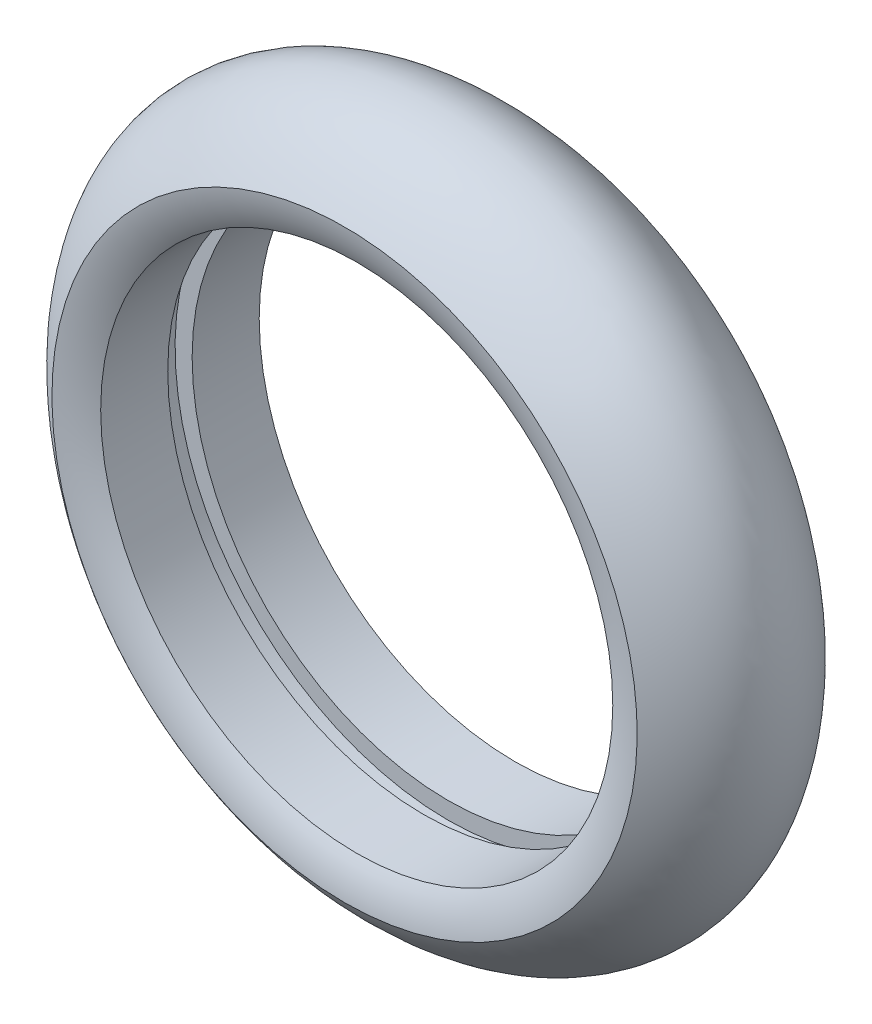
ISO-10303-21;
HEADER;
FILE_DESCRIPTION(('STEP AP214'),'2;1');
FILE_NAME('part.step','',(''),(''),'','','');
FILE_SCHEMA(('AUTOMOTIVE_DESIGN { 1 0 10303 214 1 1 1 1 }'));
ENDSEC;
DATA;
#1=APPLICATION_CONTEXT('core data for automotive mechanical design processes');
#2=APPLICATION_PROTOCOL_DEFINITION('international standard','automotive_design',2000,#1);
#3=PRODUCT_CONTEXT('',#1,'mechanical');
#4=PRODUCT('Part','Part','',(#3));
#5=PRODUCT_RELATED_PRODUCT_CATEGORY('part','',(#4));
#6=PRODUCT_DEFINITION_FORMATION('','',#4);
#7=PRODUCT_DEFINITION_CONTEXT('part definition',#1,'design');
#8=PRODUCT_DEFINITION('design','',#6,#7);
#9=PRODUCT_DEFINITION_SHAPE('','',#8);
#10=(LENGTH_UNIT() NAMED_UNIT(*) SI_UNIT(.MILLI.,.METRE.));
#11=(NAMED_UNIT(*) PLANE_ANGLE_UNIT() SI_UNIT($,.RADIAN.));
#12=(NAMED_UNIT(*) SI_UNIT($,.STERADIAN.) SOLID_ANGLE_UNIT());
#13=UNCERTAINTY_MEASURE_WITH_UNIT(LENGTH_MEASURE(1.E-05),#10,'distance_accuracy_value','');
#14=(GEOMETRIC_REPRESENTATION_CONTEXT(3) GLOBAL_UNCERTAINTY_ASSIGNED_CONTEXT((#13)) GLOBAL_UNIT_ASSIGNED_CONTEXT((#10,
#11,#12)) REPRESENTATION_CONTEXT('',''));
#15=CARTESIAN_POINT('',(0.,0.,0.));
#16=DIRECTION('',(0.,0.,1.));
#17=DIRECTION('',(1.,0.,0.));
#18=AXIS2_PLACEMENT_3D('',#15,#16,#17);
#19=CARTESIAN_POINT('',(0.,0.,0.));
#20=DIRECTION('',(0.,0.,1.));
#21=DIRECTION('',(0.,-1.,0.));
#22=AXIS2_PLACEMENT_3D('',#19,#20,#21);
#23=TOROIDAL_SURFACE('',#22,24.8333333333333,7.54615428178118);
#24=CARTESIAN_POINT('',(0.,0.,6.5));
#25=DIRECTION('',(0.,0.,1.));
#26=DIRECTION('',(0.,-1.,0.));
#27=AXIS2_PLACEMENT_3D('',#24,#25,#26);
#28=CIRCLE('',#27,21.);
#29=CARTESIAN_POINT('',(0.,-21.,6.5));
#30=VERTEX_POINT('',#29);
#31=EDGE_CURVE('E62',#30,#30,#28,.T.);
#32=ORIENTED_EDGE('',*,*,#31,.F.);
#33=EDGE_LOOP('',(#32));
#34=FACE_BOUND('',#33,.T.);
#35=CARTESIAN_POINT('',(0.,0.,7.5));
#36=DIRECTION('',(0.,0.,1.));
#37=DIRECTION('',(0.,-1.,0.));
#38=AXIS2_PLACEMENT_3D('',#35,#36,#37);
#39=CIRCLE('',#38,24.);
#40=CARTESIAN_POINT('',(0.,-24.,7.5));
#41=VERTEX_POINT('',#40);
#42=EDGE_CURVE('E10',#41,#41,#39,.T.);
#43=ORIENTED_EDGE('',*,*,#42,.T.);
#44=EDGE_LOOP('',(#43));
#45=FACE_BOUND('',#44,.T.);
#46=ADVANCED_FACE('F34',(#34,#45),#23,.T.);
#47=CARTESIAN_POINT('',(0.,0.,0.));
#48=DIRECTION('',(1.,0.,0.));
#49=DIRECTION('',(0.,1.,0.));
#50=AXIS2_PLACEMENT_3D('',#47,#48,#49);
#51=ELLIPSE('',#50,29.,13.3609187911384);
#52=TRIMMED_CURVE('',#51,(PARAMETER_VALUE(4.71238898038469)),
(PARAMETER_VALUE(7.85398163397448)),.T.,.PARAMETER.);
#53=CARTESIAN_POINT('',(0.,0.,13.3609187911384));
#54=DIRECTION('',(0.,0.,1.));
#55=AXIS1_PLACEMENT('',#53,#54);
#56=SURFACE_OF_REVOLUTION('',#52,#55);
#57=ORIENTED_EDGE('',*,*,#42,.F.);
#58=EDGE_LOOP('',(#57));
#59=FACE_BOUND('',#58,.T.);
#60=CARTESIAN_POINT('',(0.,0.,-7.5));
#61=DIRECTION('',(0.,0.,1.));
#62=DIRECTION('',(0.,-1.,0.));
#63=AXIS2_PLACEMENT_3D('',#60,#61,#62);
#64=CIRCLE('',#63,24.);
#65=CARTESIAN_POINT('',(0.,-24.,-7.5));
#66=VERTEX_POINT('',#65);
#67=EDGE_CURVE('E40',#66,#66,#64,.T.);
#68=ORIENTED_EDGE('',*,*,#67,.T.);
#69=EDGE_LOOP('',(#68));
#70=FACE_BOUND('',#69,.T.);
#71=ADVANCED_FACE('F66',(#59,#70),#56,.T.);
#72=CARTESIAN_POINT('',(0.,0.,0.));
#73=DIRECTION('',(0.,0.,1.));
#74=DIRECTION('',(0.,-1.,0.));
#75=AXIS2_PLACEMENT_3D('',#72,#73,#74);
#76=TOROIDAL_SURFACE('',#75,24.8333333333333,7.54615428178118);
#77=ORIENTED_EDGE('',*,*,#67,.F.);
#78=EDGE_LOOP('',(#77));
#79=FACE_BOUND('',#78,.T.);
#80=CARTESIAN_POINT('',(0.,0.,-6.5));
#81=DIRECTION('',(0.,0.,1.));
#82=DIRECTION('',(0.,-1.,0.));
#83=AXIS2_PLACEMENT_3D('',#80,#81,#82);
#84=CIRCLE('',#83,21.);
#85=CARTESIAN_POINT('',(0.,-21.,-6.5));
#86=VERTEX_POINT('',#85);
#87=EDGE_CURVE('E44',#86,#86,#84,.T.);
#88=ORIENTED_EDGE('',*,*,#87,.T.);
#89=EDGE_LOOP('',(#88));
#90=FACE_BOUND('',#89,.T.);
#91=ADVANCED_FACE('F69',(#79,#90),#76,.T.);
#92=CARTESIAN_POINT('',(0.,0.,13.3609187911384));
#93=DIRECTION('',(0.,0.,1.));
#94=DIRECTION('',(0.,-1.,0.));
#95=AXIS2_PLACEMENT_3D('',#92,#93,#94);
#96=CYLINDRICAL_SURFACE('',#95,21.);
#97=ORIENTED_EDGE('',*,*,#87,.F.);
#98=EDGE_LOOP('',(#97));
#99=FACE_BOUND('',#98,.T.);
#100=CARTESIAN_POINT('',(0.,0.,-1.));
#101=DIRECTION('',(0.,0.,1.));
#102=DIRECTION('',(0.,-1.,0.));
#103=AXIS2_PLACEMENT_3D('',#100,#101,#102);
#104=CIRCLE('',#103,21.);
#105=CARTESIAN_POINT('',(0.,-21.,-1.));
#106=VERTEX_POINT('',#105);
#107=EDGE_CURVE('E48',#106,#106,#104,.T.);
#108=ORIENTED_EDGE('',*,*,#107,.T.);
#109=EDGE_LOOP('',(#108));
#110=FACE_BOUND('',#109,.T.);
#111=ADVANCED_FACE('F73',(#99,#110),#96,.F.);
#112=CARTESIAN_POINT('',(0.,22.4,-1.));
#113=DIRECTION('',(0.,0.,-1.));
#114=DIRECTION('',(0.,1.,0.));
#115=AXIS2_PLACEMENT_3D('',#112,#113,#114);
#116=PLANE('',#115);
#117=ORIENTED_EDGE('',*,*,#107,.F.);
#118=EDGE_LOOP('',(#117));
#119=FACE_BOUND('',#118,.T.);
#120=CARTESIAN_POINT('',(0.,0.,-1.));
#121=DIRECTION('',(0.,0.,1.));
#122=DIRECTION('',(0.,-1.,0.));
#123=AXIS2_PLACEMENT_3D('',#120,#121,#122);
#124=CIRCLE('',#123,22.4);
#125=CARTESIAN_POINT('',(0.,-22.4,-1.));
#126=VERTEX_POINT('',#125);
#127=EDGE_CURVE('E53',#126,#126,#124,.T.);
#128=ORIENTED_EDGE('',*,*,#127,.T.);
#129=EDGE_LOOP('',(#128));
#130=FACE_BOUND('',#129,.T.);
#131=ADVANCED_FACE('F77',(#119,#130),#116,.F.);
#132=CARTESIAN_POINT('',(0.,0.,13.3609187911384));
#133=DIRECTION('',(0.,0.,1.));
#134=DIRECTION('',(0.,-1.,0.));
#135=AXIS2_PLACEMENT_3D('',#132,#133,#134);
#136=CYLINDRICAL_SURFACE('',#135,22.4);
#137=ORIENTED_EDGE('',*,*,#127,.F.);
#138=EDGE_LOOP('',(#137));
#139=FACE_BOUND('',#138,.T.);
#140=CARTESIAN_POINT('',(0.,0.,1.));
#141=DIRECTION('',(0.,0.,1.));
#142=DIRECTION('',(0.,-1.,0.));
#143=AXIS2_PLACEMENT_3D('',#140,#141,#142);
#144=CIRCLE('',#143,22.4);
#145=CARTESIAN_POINT('',(0.,-22.4,1.));
#146=VERTEX_POINT('',#145);
#147=EDGE_CURVE('E56',#146,#146,#144,.T.);
#148=ORIENTED_EDGE('',*,*,#147,.T.);
#149=EDGE_LOOP('',(#148));
#150=FACE_BOUND('',#149,.T.);
#151=ADVANCED_FACE('F81',(#139,#150),#136,.F.);
#152=CARTESIAN_POINT('',(0.,21.,1.));
#153=DIRECTION('',(0.,0.,1.));
#154=DIRECTION('',(0.,-1.,0.));
#155=AXIS2_PLACEMENT_3D('',#152,#153,#154);
#156=PLANE('',#155);
#157=ORIENTED_EDGE('',*,*,#147,.F.);
#158=EDGE_LOOP('',(#157));
#159=FACE_BOUND('',#158,.T.);
#160=CARTESIAN_POINT('',(0.,0.,1.));
#161=DIRECTION('',(0.,0.,1.));
#162=DIRECTION('',(0.,-1.,0.));
#163=AXIS2_PLACEMENT_3D('',#160,#161,#162);
#164=CIRCLE('',#163,21.);
#165=CARTESIAN_POINT('',(0.,-21.,1.));
#166=VERTEX_POINT('',#165);
#167=EDGE_CURVE('E59',#166,#166,#164,.T.);
#168=ORIENTED_EDGE('',*,*,#167,.T.);
#169=EDGE_LOOP('',(#168));
#170=FACE_BOUND('',#169,.T.);
#171=ADVANCED_FACE('F85',(#159,#170),#156,.F.);
#172=CARTESIAN_POINT('',(0.,0.,13.3609187911384));
#173=DIRECTION('',(0.,0.,1.));
#174=DIRECTION('',(0.,-1.,0.));
#175=AXIS2_PLACEMENT_3D('',#172,#173,#174);
#176=CYLINDRICAL_SURFACE('',#175,21.);
#177=ORIENTED_EDGE('',*,*,#167,.F.);
#178=EDGE_LOOP('',(#177));
#179=FACE_BOUND('',#178,.T.);
#180=ORIENTED_EDGE('',*,*,#31,.T.);
#181=EDGE_LOOP('',(#180));
#182=FACE_BOUND('',#181,.T.);
#183=ADVANCED_FACE('F89',(#179,#182),#176,.F.);
#184=CLOSED_SHELL('',(#46,#71,#91,#111,#131,#151,#171,#183));
#185=MANIFOLD_SOLID_BREP('B2',#184);
#186=ADVANCED_BREP_SHAPE_REPRESENTATION('',(#18,#185),#14);
#187=SHAPE_DEFINITION_REPRESENTATION(#9,#186);
ENDSEC;
END-ISO-10303-21;
